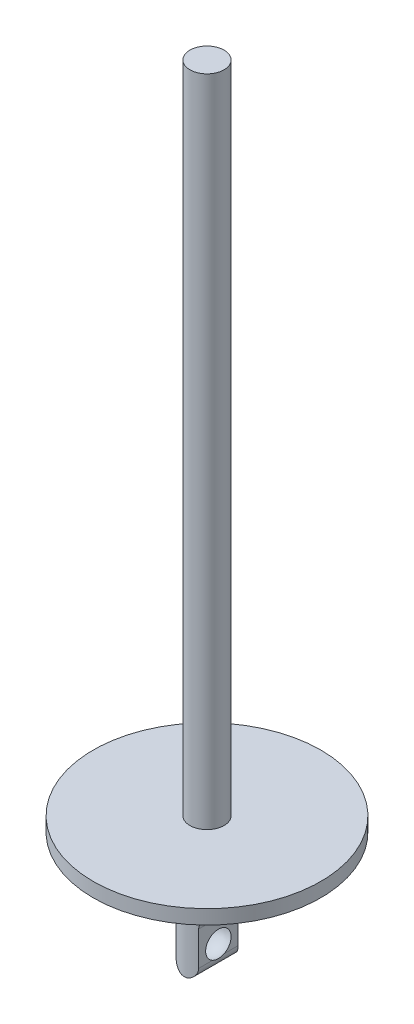
ISO-10303-21;
HEADER;
FILE_DESCRIPTION(('STEP AP214'),'2;1');
FILE_NAME('part.step','',(''),(''),'','','');
FILE_SCHEMA(('AUTOMOTIVE_DESIGN { 1 0 10303 214 1 1 1 1 }'));
ENDSEC;
DATA;
#1=APPLICATION_CONTEXT('core data for automotive mechanical design processes');
#2=APPLICATION_PROTOCOL_DEFINITION('international standard','automotive_design',2000,#1);
#3=PRODUCT_CONTEXT('',#1,'mechanical');
#4=PRODUCT('Part','Part','',(#3));
#5=PRODUCT_RELATED_PRODUCT_CATEGORY('part','',(#4));
#6=PRODUCT_DEFINITION_FORMATION('','',#4);
#7=PRODUCT_DEFINITION_CONTEXT('part definition',#1,'design');
#8=PRODUCT_DEFINITION('design','',#6,#7);
#9=PRODUCT_DEFINITION_SHAPE('','',#8);
#10=(LENGTH_UNIT() NAMED_UNIT(*) SI_UNIT(.MILLI.,.METRE.));
#11=(NAMED_UNIT(*) PLANE_ANGLE_UNIT() SI_UNIT($,.RADIAN.));
#12=(NAMED_UNIT(*) SI_UNIT($,.STERADIAN.) SOLID_ANGLE_UNIT());
#13=UNCERTAINTY_MEASURE_WITH_UNIT(LENGTH_MEASURE(1.E-05),#10,'distance_accuracy_value','');
#14=(GEOMETRIC_REPRESENTATION_CONTEXT(3) GLOBAL_UNCERTAINTY_ASSIGNED_CONTEXT((#13)) GLOBAL_UNIT_ASSIGNED_CONTEXT((#10,
#11,#12)) REPRESENTATION_CONTEXT('',''));
#15=CARTESIAN_POINT('',(0.,0.,0.));
#16=DIRECTION('',(0.,0.,1.));
#17=DIRECTION('',(1.,0.,0.));
#18=AXIS2_PLACEMENT_3D('',#15,#16,#17);
#19=CARTESIAN_POINT('',(4.,0.,-40.));
#20=DIRECTION('',(-1.,0.,0.));
#21=DIRECTION('',(0.,0.,1.));
#22=AXIS2_PLACEMENT_3D('',#19,#20,#21);
#23=PLANE('',#22);
#24=DIRECTION('',(0.,-1.,0.));
#25=VECTOR('',#24,1.);
#26=CARTESIAN_POINT('',(4.,40.,6.92820323027551));
#27=LINE('',#26,#25);
#28=CARTESIAN_POINT('',(4.,4.,6.92820323027551));
#29=VERTEX_POINT('',#28);
#30=CARTESIAN_POINT('',(4.,16.,6.92820323027551));
#31=VERTEX_POINT('',#30);
#32=EDGE_CURVE('E115',#29,#31,#27,.F.);
#33=ORIENTED_EDGE('',*,*,#32,.F.);
#34=DIRECTION('',(0.,0.,1.));
#35=VECTOR('',#34,1.);
#36=CARTESIAN_POINT('',(4.,4.,-40.));
#37=LINE('',#36,#35);
#38=CARTESIAN_POINT('',(4.,4.,2.));
#39=VERTEX_POINT('',#38);
#40=EDGE_CURVE('E223',#29,#39,#37,.F.);
#41=ORIENTED_EDGE('',*,*,#40,.T.);
#42=CARTESIAN_POINT('',(4.,8.,0.));
#43=DIRECTION('',(-1.,0.,0.));
#44=DIRECTION('',(0.,0.,1.));
#45=AXIS2_PLACEMENT_3D('',#42,#43,#44);
#46=CIRCLE('',#45,4.47213595499958);
#47=CARTESIAN_POINT('',(4.,4.,-2.));
#48=VERTEX_POINT('',#47);
#49=EDGE_CURVE('E119',#48,#39,#46,.F.);
#50=ORIENTED_EDGE('',*,*,#49,.F.);
#51=DIRECTION('',(0.,0.,1.));
#52=VECTOR('',#51,1.);
#53=CARTESIAN_POINT('',(4.,4.,-40.));
#54=LINE('',#53,#52);
#55=CARTESIAN_POINT('',(4.,4.,-6.92820323027551));
#56=VERTEX_POINT('',#55);
#57=EDGE_CURVE('E224',#48,#56,#54,.F.);
#58=ORIENTED_EDGE('',*,*,#57,.T.);
#59=DIRECTION('',(0.,-1.,0.));
#60=VECTOR('',#59,1.);
#61=CARTESIAN_POINT('',(4.,40.,-6.92820323027551));
#62=LINE('',#61,#60);
#63=CARTESIAN_POINT('',(4.,16.,-6.92820323027551));
#64=VERTEX_POINT('',#63);
#65=EDGE_CURVE('E117',#64,#56,#62,.T.);
#66=ORIENTED_EDGE('',*,*,#65,.F.);
#67=DIRECTION('',(0.,0.,1.));
#68=VECTOR('',#67,1.);
#69=CARTESIAN_POINT('',(4.,16.,6.92820323027551));
#70=LINE('',#69,#68);
#71=EDGE_CURVE('E230',#64,#31,#70,.T.);
#72=ORIENTED_EDGE('',*,*,#71,.T.);
#73=EDGE_LOOP('',(#33,#41,#50,#58,#66,#72));
#74=FACE_BOUND('',#73,.T.);
#75=ADVANCED_FACE('F35',(#74),#23,.F.);
#76=CARTESIAN_POINT('',(-4.,0.,-40.));
#77=DIRECTION('',(-1.,0.,0.));
#78=DIRECTION('',(0.,0.,1.));
#79=AXIS2_PLACEMENT_3D('',#76,#77,#78);
#80=PLANE('',#79);
#81=DIRECTION('',(0.,-1.,0.));
#82=VECTOR('',#81,1.);
#83=CARTESIAN_POINT('',(-4.,40.,-6.92820323027551));
#84=LINE('',#83,#82);
#85=CARTESIAN_POINT('',(-4.,16.,-6.92820323027551));
#86=VERTEX_POINT('',#85);
#87=CARTESIAN_POINT('',(-4.,4.,-6.92820323027551));
#88=VERTEX_POINT('',#87);
#89=EDGE_CURVE('E105',#86,#88,#84,.T.);
#90=ORIENTED_EDGE('',*,*,#89,.T.);
#91=DIRECTION('',(0.,0.,1.));
#92=VECTOR('',#91,1.);
#93=CARTESIAN_POINT('',(-4.,4.,6.92820323027551));
#94=LINE('',#93,#92);
#95=CARTESIAN_POINT('',(-4.,4.,-2.));
#96=VERTEX_POINT('',#95);
#97=EDGE_CURVE('E143',#88,#96,#94,.T.);
#98=ORIENTED_EDGE('',*,*,#97,.T.);
#99=CARTESIAN_POINT('',(-4.,8.,0.));
#100=DIRECTION('',(-1.,0.,0.));
#101=DIRECTION('',(0.,0.,1.));
#102=AXIS2_PLACEMENT_3D('',#99,#100,#101);
#103=CIRCLE('',#102,4.47213595499958);
#104=CARTESIAN_POINT('',(-4.,4.,2.));
#105=VERTEX_POINT('',#104);
#106=EDGE_CURVE('E139',#96,#105,#103,.F.);
#107=ORIENTED_EDGE('',*,*,#106,.T.);
#108=DIRECTION('',(0.,0.,1.));
#109=VECTOR('',#108,1.);
#110=CARTESIAN_POINT('',(-4.,4.,6.92820323027551));
#111=LINE('',#110,#109);
#112=CARTESIAN_POINT('',(-4.,4.,6.92820323027551));
#113=VERTEX_POINT('',#112);
#114=EDGE_CURVE('E109',#105,#113,#111,.T.);
#115=ORIENTED_EDGE('',*,*,#114,.T.);
#116=DIRECTION('',(0.,-1.,0.));
#117=VECTOR('',#116,1.);
#118=CARTESIAN_POINT('',(-4.,40.,6.92820323027551));
#119=LINE('',#118,#117);
#120=CARTESIAN_POINT('',(-4.,16.,6.92820323027551));
#121=VERTEX_POINT('',#120);
#122=EDGE_CURVE('E108',#113,#121,#119,.F.);
#123=ORIENTED_EDGE('',*,*,#122,.T.);
#124=DIRECTION('',(0.,0.,1.));
#125=VECTOR('',#124,1.);
#126=CARTESIAN_POINT('',(-4.,16.,-6.92820323027551));
#127=LINE('',#126,#125);
#128=EDGE_CURVE('E99',#121,#86,#127,.F.);
#129=ORIENTED_EDGE('',*,*,#128,.T.);
#130=EDGE_LOOP('',(#90,#98,#107,#115,#123,#129));
#131=FACE_BOUND('',#130,.T.);
#132=ADVANCED_FACE('F103',(#131),#80,.T.);
#133=CARTESIAN_POINT('',(0.,40.,0.));
#134=DIRECTION('',(0.,-1.,0.));
#135=DIRECTION('',(0.,0.,-1.));
#136=AXIS2_PLACEMENT_3D('',#133,#134,#135);
#137=CYLINDRICAL_SURFACE('',#136,8.);
#138=CARTESIAN_POINT('',(0.,40.,0.));
#139=DIRECTION('',(0.,1.,0.));
#140=DIRECTION('',(0.,0.,1.));
#141=AXIS2_PLACEMENT_3D('',#138,#139,#140);
#142=CIRCLE('',#141,8.);
#143=CARTESIAN_POINT('',(0.,40.,8.));
#144=VERTEX_POINT('',#143);
#145=EDGE_CURVE('E110',#144,#144,#142,.T.);
#146=ORIENTED_EDGE('',*,*,#145,.F.);
#147=EDGE_LOOP('',(#146));
#148=FACE_BOUND('',#147,.T.);
#149=ORIENTED_EDGE('',*,*,#122,.F.);
#150=CARTESIAN_POINT('',(-4.,4.,6.92820323027551));
#151=CARTESIAN_POINT('',(-4.00001889511112,3.89523971130093,6.92817241064342));
#152=CARTESIAN_POINT('',(-3.9958851388229,3.79049652922698,6.93057853736818));
#153=CARTESIAN_POINT('',(-3.97946096093408,3.58192507530325,6.94003264237105));
#154=CARTESIAN_POINT('',(-3.96717555222761,3.47809628088356,6.94707776785642));
#155=CARTESIAN_POINT('',(-3.93469109728926,3.27270248431589,6.96552456610761));
#156=CARTESIAN_POINT('',(-3.91453848374761,3.17112782917601,6.97690066761948));
#157=CARTESIAN_POINT('',(-3.86658519524572,2.97034740767348,7.00358982135438));
#158=CARTESIAN_POINT('',(-3.83878364235436,2.87114191466028,7.018903325492));
#159=CARTESIAN_POINT('',(-3.74447669890891,2.57846187257637,7.06993863228255));
#160=CARTESIAN_POINT('',(-3.66696933640402,2.38930687754068,7.11081556166273));
#161=CARTESIAN_POINT('',(-3.48522192136891,2.02653902083935,7.2016321692887));
#162=CARTESIAN_POINT('',(-3.38093933259429,1.85295148787515,7.25158623059337));
#163=CARTESIAN_POINT('',(-3.13866436996509,1.51077440200365,7.35987761255747));
#164=CARTESIAN_POINT('',(-2.99861322198538,1.34375338254482,7.41856641759924));
#165=CARTESIAN_POINT('',(-2.69295217819015,1.03431783180104,7.53489750387284));
#166=CARTESIAN_POINT('',(-2.5273344243365,0.891910894411421,7.59253945724062));
#167=CARTESIAN_POINT('',(-2.25622055414173,0.694986071525579,7.67588941919854));
#168=CARTESIAN_POINT('',(-2.15861234463414,0.630407746082989,7.70397528414256));
#169=CARTESIAN_POINT('',(-1.95758499573506,0.50978763068386,7.75749034734717));
#170=CARTESIAN_POINT('',(-1.85416837571886,0.453742178177164,7.78292068395482));
#171=CARTESIAN_POINT('',(-1.64226130195918,0.350774550177898,7.83037427609883));
#172=CARTESIAN_POINT('',(-1.53377549204667,0.30384422008848,7.85240057332805));
#173=CARTESIAN_POINT('',(-1.31247036586189,0.219600120257664,7.89240442815357));
#174=CARTESIAN_POINT('',(-1.19965387926253,0.182280189943056,7.91038457852208));
#175=CARTESIAN_POINT('',(-0.997570785436065,0.125321816701381,7.93805196091601));
#176=CARTESIAN_POINT('',(-0.90901862461868,0.103589144047799,7.9486949698625));
#177=CARTESIAN_POINT('',(-0.730360697796369,0.066185096871143,7.96709704429469));
#178=CARTESIAN_POINT('',(-0.640255280744232,0.0505123789954081,7.97485674892778));
#179=CARTESIAN_POINT('',(-0.458751817582987,0.0253357155205294,7.98735435689842));
#180=CARTESIAN_POINT('',(-0.367351140845406,0.0158470108604004,7.99208479389587));
#181=CARTESIAN_POINT('',(-0.183968921271151,0.00317271045894419,7.99841382965378));
#182=CARTESIAN_POINT('',(-0.091987154991078,-1.02912682492411E-05,8.00001113951861));
#183=CARTESIAN_POINT('',(0.,0.,8.));
#184=B_SPLINE_CURVE_WITH_KNOTS('',3,(#150,#151,#152,#153,#154,#155,#156,#157,#158,#159,#160,
#161,#162,#163,#164,#165,#166,#167,#168,#169,#170,#171,#172,#173,#174,#175,#176,#177,#178,#179,
#180,#181,#182,#183),.UNSPECIFIED.,.F.,.F.,(4,2,2,2,2,2,2,2,2,2,2,2,2,2,2,2,4),(0.,
0.314143681874408,0.628094358546584,0.940219432825869,1.25238034720108,1.87484254292889,
2.49829979351164,3.17272191455751,3.84735173721949,4.2080362349451,4.56856547755992,
4.92877068163394,5.28874440462505,5.56390038451801,5.83899533363794,6.11476573525637,
6.39064955863021),.UNSPECIFIED.);
#185=CARTESIAN_POINT('',(0.,0.,8.));
#186=VERTEX_POINT('',#185);
#187=EDGE_CURVE('E199',#113,#186,#184,.T.);
#188=ORIENTED_EDGE('',*,*,#187,.T.);
#189=CARTESIAN_POINT('',(0.,0.,8.));
#190=CARTESIAN_POINT('',(0.105594682815034,-1.69654241774166E-05,8.00001874517194));
#191=CARTESIAN_POINT('',(0.211177348556156,0.00418086172791801,7.99790982858387));
#192=CARTESIAN_POINT('',(0.421479944942973,0.0208743247073179,7.98957730399685));
#193=CARTESIAN_POINT('',(0.526200205052481,0.0333666272651057,7.98335534889358));
#194=CARTESIAN_POINT('',(0.733549997385983,0.0664416277232895,7.96697472634551));
#195=CARTESIAN_POINT('',(0.836186902712697,0.0869870514398855,7.956834199177));
#196=CARTESIAN_POINT('',(1.03911455405645,0.135915517762744,7.93288714668069));
#197=CARTESIAN_POINT('',(1.13940515446159,0.164299045410226,7.91908039447986));
#198=CARTESIAN_POINT('',(1.43550979836389,0.260712761075189,7.87267696868857));
#199=CARTESIAN_POINT('',(1.62698671481587,0.340075956974583,7.83506109947247));
#200=CARTESIAN_POINT('',(1.99372967134751,0.526172356981913,7.74988077275273));
#201=CARTESIAN_POINT('',(2.16897909699032,0.632933199454451,7.70230627811135));
#202=CARTESIAN_POINT('',(2.51001916646317,0.87806687837632,7.59825185414079));
#203=CARTESIAN_POINT('',(2.67461462257841,1.01795009685097,7.54140920704196));
#204=CARTESIAN_POINT('',(2.97910921395157,1.32206695818518,7.42640315399995));
#205=CARTESIAN_POINT('',(3.11898832089479,1.486320152225,7.36823871965682));
#206=CARTESIAN_POINT('',(3.38112219764268,1.85011586597194,7.25190771644084));
#207=CARTESIAN_POINT('',(3.50113933782059,2.05141453628313,7.1940975941462));
#208=CARTESIAN_POINT('',(3.65396057094637,2.36832787229876,7.11700985885203));
#209=CARTESIAN_POINT('',(3.70035498768008,2.47641790945865,7.09292552193289));
#210=CARTESIAN_POINT('',(3.78364788460679,2.6969761670208,7.04884597286059));
#211=CARTESIAN_POINT('',(3.82055280546655,2.80944135793523,7.02884798913949));
#212=CARTESIAN_POINT('',(3.87669185924337,3.01036704836625,6.99800135068758));
#213=CARTESIAN_POINT('',(3.89804119248436,3.09808465306088,6.98610914498016));
#214=CARTESIAN_POINT('',(3.93480596648565,3.27510700361364,6.96546802001393));
#215=CARTESIAN_POINT('',(3.95022287093019,3.3644113522848,6.95671832545156));
#216=CARTESIAN_POINT('',(3.97501646212313,3.54445090359165,6.94258315359293));
#217=CARTESIAN_POINT('',(3.98437113472389,3.63519010881508,6.93720993963143));
#218=CARTESIAN_POINT('',(3.99687028574113,3.81728325516172,6.93000987487536));
#219=CARTESIAN_POINT('',(4.00001140687759,3.90863750186975,6.92818494128182));
#220=CARTESIAN_POINT('',(4.,4.,6.92820323027551));
#221=B_SPLINE_CURVE_WITH_KNOTS('',3,(#189,#190,#191,#192,#193,#194,#195,#196,#197,#198,#199,
#200,#201,#202,#203,#204,#205,#206,#207,#208,#209,#210,#211,#212,#213,#214,#215,#216,#217,#218,
#219,#220),.UNSPECIFIED.,.F.,.F.,(4,2,2,2,2,2,2,2,2,2,2,2,2,2,2,4),(0.,0.316659613551836,
0.633192049259075,0.948276381733998,1.26338021677619,1.89229300054356,2.5218427339614,
3.18909856836255,3.85689264275289,4.57697601709805,4.93675650919362,5.29629216432158,
5.56922814326256,5.84209673856643,6.11595074645078,6.38995268160922),.UNSPECIFIED.);
#222=EDGE_CURVE('E193',#186,#29,#221,.T.);
#223=ORIENTED_EDGE('',*,*,#222,.T.);
#224=ORIENTED_EDGE('',*,*,#32,.T.);
#225=CARTESIAN_POINT('',(4.,16.,6.92820323027551));
#226=CARTESIAN_POINT('',(3.99998357269862,16.0979942978552,6.92819687421308));
#227=CARTESIAN_POINT('',(4.00360039286629,16.1959870130739,6.92612404616006));
#228=CARTESIAN_POINT('',(4.01798256563666,16.3912620961276,6.91779905606764));
#229=CARTESIAN_POINT('',(4.02874748699655,16.4885445064572,6.91154714615087));
#230=CARTESIAN_POINT('',(4.05728851629562,16.6815725180978,6.89482898223557));
#231=CARTESIAN_POINT('',(4.07505507470297,16.7773200285249,6.88436846794728));
#232=CARTESIAN_POINT('',(4.1173652650708,16.9667269459903,6.85914814827643));
#233=CARTESIAN_POINT('',(4.14190879704184,17.0603863838147,6.84438840632573));
#234=CARTESIAN_POINT('',(4.19746115576878,17.2449871828087,6.8104608710796));
#235=CARTESIAN_POINT('',(4.22847235072967,17.3359275343707,6.79129146287148));
#236=CARTESIAN_POINT('',(4.29654722462371,17.5144527301295,6.74842940726129));
#237=CARTESIAN_POINT('',(4.33361311971043,17.6020363311348,6.72473510310871));
#238=CARTESIAN_POINT('',(4.41324686894522,17.7731614380423,6.67274377700483));
#239=CARTESIAN_POINT('',(4.45581067734037,17.8567058547426,6.64445013565202));
#240=CARTESIAN_POINT('',(4.54587661740419,18.0193255282276,6.58315833487947));
#241=CARTESIAN_POINT('',(4.59338056260804,18.0983991272044,6.55015844612319));
#242=CARTESIAN_POINT('',(4.69290734869698,18.2520112196884,6.47922591643649));
#243=CARTESIAN_POINT('',(4.7449529546435,18.3265232559707,6.44126788845226));
#244=CARTESIAN_POINT('',(4.85259969134724,18.4702118722569,6.36056726199054));
#245=CARTESIAN_POINT('',(4.90820208934683,18.5393865310326,6.31782295410232));
#246=CARTESIAN_POINT('',(5.07916508086168,18.7384733242557,6.18248409002506));
#247=CARTESIAN_POINT('',(5.19874940709528,18.8600507877029,6.08273654037452));
#248=CARTESIAN_POINT('',(5.4501926229447,19.0869057388067,5.85879327573809));
#249=CARTESIAN_POINT('',(5.58235344124037,19.1907125797709,5.73346802078703));
#250=CARTESIAN_POINT('',(5.84542628459508,19.373950533241,5.46500734543136));
#251=CARTESIAN_POINT('',(5.97633780145532,19.4533721041083,5.32186498413528));
#252=CARTESIAN_POINT('',(6.19988925233047,19.5737215989879,5.05801173016824));
#253=CARTESIAN_POINT('',(6.29395690633154,19.6193107813145,4.94056359414615));
#254=CARTESIAN_POINT('',(6.47688877607476,19.7000172207874,4.69818635304316));
#255=CARTESIAN_POINT('',(6.56575082721865,19.7351301461812,4.57325417900766));
#256=CARTESIAN_POINT('',(6.73721638942498,19.7965372812035,4.31668752077667));
#257=CARTESIAN_POINT('',(6.81980479627336,19.8228106995745,4.18503806231928));
#258=CARTESIAN_POINT('',(6.97766120542416,19.8680178636714,3.91619221091376));
#259=CARTESIAN_POINT('',(7.0529272610161,19.8869496615369,3.77899435652669));
#260=CARTESIAN_POINT('',(7.21970032249709,19.9243760042334,3.45252788348875));
#261=CARTESIAN_POINT('',(7.3080596291559,19.9405452357865,3.26137858256724));
#262=CARTESIAN_POINT('',(7.46957400186451,19.9655170244585,2.87226179648576));
#263=CARTESIAN_POINT('',(7.54272294019432,19.9743166169159,2.67429160072329));
#264=CARTESIAN_POINT('',(7.67315222490469,19.9871624066746,2.27314642024895));
#265=CARTESIAN_POINT('',(7.73043943961995,19.9912106638339,2.06997373005238));
#266=CARTESIAN_POINT('',(7.82876270419721,19.9966361831549,1.65980222125565));
#267=CARTESIAN_POINT('',(7.86980547249243,19.998014550459,1.45280502156214));
#268=CARTESIAN_POINT('',(7.93504901307514,19.9996049849505,1.0384959270269));
#269=CARTESIAN_POINT('',(7.95943112101189,19.9998297887745,0.831212859058599));
#270=CARTESIAN_POINT('',(7.98378196715674,19.9999740719228,0.519661949906857));
#271=CARTESIAN_POINT('',(7.98986186395169,19.9999901135713,0.41583887891577));
#272=CARTESIAN_POINT('',(7.99797124060996,20.0000006341606,0.208014164773634));
#273=CARTESIAN_POINT('',(7.99999992175598,19.9999951088498,0.104012490454487));
#274=CARTESIAN_POINT('',(8.,20.,0.));
#275=B_SPLINE_CURVE_WITH_KNOTS('',3,(#225,#226,#227,#228,#229,#230,#231,#232,#233,#234,#235,
#236,#237,#238,#239,#240,#241,#242,#243,#244,#245,#246,#247,#248,#249,#250,#251,#252,#253,#254,
#255,#256,#257,#258,#259,#260,#261,#262,#263,#264,#265,#266,#267,#268,#269,#270,#271,#272,#273,
#274),.UNSPECIFIED.,.F.,.F.,(4,2,2,2,2,2,2,2,2,2,2,2,2,2,2,2,2,2,2,2,2,2,2,2,4),(0.,
0.293892036944188,0.587766345079801,0.881241217600609,1.17471176033982,1.46828994975949,
1.76197583703679,2.05544682774577,2.34902593517615,2.64417193263104,2.93942367916696,
3.52953673448329,4.15609945991866,4.78290703966625,5.25398364707331,5.72525476748456,
6.19762673157799,6.67012393861144,7.30284836022076,7.93582719238909,8.56853150622857,
9.20097386994807,9.82641810002737,10.1383526923261,10.4503487780106),.UNSPECIFIED.);
#276=CARTESIAN_POINT('',(8.,20.,0.));
#277=VERTEX_POINT('',#276);
#278=EDGE_CURVE('E57',#31,#277,#275,.T.);
#279=ORIENTED_EDGE('',*,*,#278,.T.);
#280=CARTESIAN_POINT('',(8.,20.,0.));
#281=CARTESIAN_POINT('',(8.00000131962729,19.9999913137288,-0.111840112448091));
#282=CARTESIAN_POINT('',(7.99765471096775,19.9999997736995,-0.223679206933449));
#283=CARTESIAN_POINT('',(7.98827577458516,19.9999878543693,-0.447160946197174));
#284=CARTESIAN_POINT('',(7.98124343899651,19.99996747502,-0.558803590645458));
#285=CARTESIAN_POINT('',(7.96249984169732,19.9998347212113,-0.781737419876212));
#286=CARTESIAN_POINT('',(7.95078691075725,19.9997223139172,-0.893028464981978));
#287=CARTESIAN_POINT('',(7.92270570658468,19.9992773661809,-1.11501339891618));
#288=CARTESIAN_POINT('',(7.90633744651494,19.9989448263611,-1.22570728943214));
#289=CARTESIAN_POINT('',(7.85006910609163,19.9973702031291,-1.55789304512798));
#290=CARTESIAN_POINT('',(7.80311110613446,19.9955484074128,-1.77823065891361));
#291=CARTESIAN_POINT('',(7.69081504724236,19.9884286267953,-2.21404342439892));
#292=CARTESIAN_POINT('',(7.62548207754534,19.9831316038726,-2.42951990464137));
#293=CARTESIAN_POINT('',(7.49098687984811,19.9679424238773,-2.81396742147681));
#294=CARTESIAN_POINT('',(7.42486810849519,19.9591047143132,-2.98404810882848));
#295=CARTESIAN_POINT('',(7.28131496344637,19.9355794312062,-3.31898127823584));
#296=CARTESIAN_POINT('',(7.20388043445886,19.920891777377,-3.48383368850355));
#297=CARTESIAN_POINT('',(7.03859723003294,19.8836655650522,-3.80669649006467));
#298=CARTESIAN_POINT('',(6.95078111650967,19.8611511456544,-3.96472625801525));
#299=CARTESIAN_POINT('',(6.7655180729736,19.805967649674,-4.27318224924326));
#300=CARTESIAN_POINT('',(6.66807470620119,19.7733023206154,-4.42361125478994));
#301=CARTESIAN_POINT('',(6.49387163575338,19.7064310596016,-4.67395425037869));
#302=CARTESIAN_POINT('',(6.41909913466045,19.6752984559767,-4.77607951703557));
#303=CARTESIAN_POINT('',(6.26611508355321,19.6056489566023,-4.97509170726807));
#304=CARTESIAN_POINT('',(6.18790443167382,19.5671339805915,-5.07197998431036));
#305=CARTESIAN_POINT('',(6.02904231951238,19.4818736180227,-5.25982586399754));
#306=CARTESIAN_POINT('',(5.94839299418043,19.435135267246,-5.35078844612732));
#307=CARTESIAN_POINT('',(5.78577043823031,19.3326293847017,-5.52622440413497));
#308=CARTESIAN_POINT('',(5.70379742805758,19.2768633427179,-5.61069884732466));
#309=CARTESIAN_POINT('',(5.55357884240452,19.1657919392138,-5.75907872914179));
#310=CARTESIAN_POINT('',(5.4853180876373,19.1119531139206,-5.82406821992398));
#311=CARTESIAN_POINT('',(5.34979778248046,18.9973817048656,-5.94879311808626));
#312=CARTESIAN_POINT('',(5.28253804764481,18.9366504093405,-6.00852950360528));
#313=CARTESIAN_POINT('',(5.15001107805503,18.8082160610026,-6.12250172792935));
#314=CARTESIAN_POINT('',(5.08474405814512,18.7405122598674,-6.17673697508364));
#315=CARTESIAN_POINT('',(4.95729159348913,18.5982760696794,-6.27948717084541));
#316=CARTESIAN_POINT('',(4.89510470977617,18.5237469165297,-6.32800480548109));
#317=CARTESIAN_POINT('',(4.77453363091258,18.3677274507891,-6.4194692394286));
#318=CARTESIAN_POINT('',(4.71616974698801,18.2862045570684,-6.46238732335727));
#319=CARTESIAN_POINT('',(4.60462855199429,18.1170061623685,-6.5423317844235));
#320=CARTESIAN_POINT('',(4.55144914586653,18.0293331714915,-6.57936054530073));
#321=CARTESIAN_POINT('',(4.45115206611111,17.8483478632115,-6.64762593779028));
#322=CARTESIAN_POINT('',(4.40403867264423,17.7550316314496,-6.67885848639655));
#323=CARTESIAN_POINT('',(4.31674448664777,17.5635527333737,-6.73560911729539));
#324=CARTESIAN_POINT('',(4.27656292647317,17.4653906052544,-6.76112783244263));
#325=CARTESIAN_POINT('',(4.2068599311223,17.2734315747937,-6.80469501491243));
#326=CARTESIAN_POINT('',(4.17672781127208,17.1799567872457,-6.82318991029318));
#327=CARTESIAN_POINT('',(4.12327615861386,16.9903107392453,-6.85562341920443));
#328=CARTESIAN_POINT('',(4.09995615143804,16.8941396670626,-6.86956235000182));
#329=CARTESIAN_POINT('',(4.06048396280482,16.7000061304892,-6.89296711021106));
#330=CARTESIAN_POINT('',(4.04431792082795,16.6020475164134,-6.90244159164346));
#331=CARTESIAN_POINT('',(4.01930937134345,16.4049223203777,-6.91703433517386));
#332=CARTESIAN_POINT('',(4.0104623645645,16.3057565186252,-6.92215527360319));
#333=CARTESIAN_POINT('',(4.00355081558526,16.1719917674771,-6.92615208600437));
#334=CARTESIAN_POINT('',(4.00221864091625,16.1375885633912,-6.92692187143991));
#335=CARTESIAN_POINT('',(4.00044384870011,16.0687915444225,-6.92794705900235));
#336=CARTESIAN_POINT('',(4.00000019988099,16.0343977650348,-6.92820305745944));
#337=CARTESIAN_POINT('',(4.,16.,-6.92820323027565));
#338=B_SPLINE_CURVE_WITH_KNOTS('',3,(#280,#281,#282,#283,#284,#285,#286,#287,#288,#289,#290,
#291,#292,#293,#294,#295,#296,#297,#298,#299,#300,#301,#302,#303,#304,#305,#306,#307,#308,#309,
#310,#311,#312,#313,#314,#315,#316,#317,#318,#319,#320,#321,#322,#323,#324,#325,#326,#327,#328,
#329,#330,#331,#332,#333,#334,#335,#336,#337),.UNSPECIFIED.,.F.,.F.,(4,2,2,2,2,2,2,2,2,2,2,2,2,
2,2,2,2,2,2,2,2,2,2,2,2,2,2,2,4),(0.,0.335493744561393,0.670988052293787,1.00660211348848,
1.3422152257567,2.0172176632674,2.69203333199167,3.23964117199473,3.78725652779131,
4.33319771156004,4.87893758312717,5.26965630997023,5.66027357042147,6.05055823621701,
6.44077856128155,6.76608585337826,7.0913324437638,7.41661397760881,7.7417420858653,
8.06847694236524,8.39507921250845,8.72191068386532,9.04870593798767,9.3481540968925,
9.64758139847144,9.94642600430207,10.2450867629247,10.3483882417461,10.4515697535404),.UNSPECIFIED.);
#339=EDGE_CURVE('E211',#277,#64,#338,.T.);
#340=ORIENTED_EDGE('',*,*,#339,.T.);
#341=ORIENTED_EDGE('',*,*,#65,.T.);
#342=CARTESIAN_POINT('',(4.,4.,-6.92820323027551));
#343=CARTESIAN_POINT('',(4.00001889511112,3.89523971130093,-6.92817241064342));
#344=CARTESIAN_POINT('',(3.9958851388229,3.79049652922698,-6.93057853736818));
#345=CARTESIAN_POINT('',(3.97946096093408,3.58192507530325,-6.94003264237105));
#346=CARTESIAN_POINT('',(3.96717555222761,3.47809628088356,-6.94707776785642));
#347=CARTESIAN_POINT('',(3.93469109728926,3.27270248431589,-6.96552456610761));
#348=CARTESIAN_POINT('',(3.91453848374761,3.17112782917601,-6.97690066761948));
#349=CARTESIAN_POINT('',(3.86658519524572,2.97034740767348,-7.00358982135438));
#350=CARTESIAN_POINT('',(3.83878364235436,2.87114191466028,-7.018903325492));
#351=CARTESIAN_POINT('',(3.74447669890891,2.57846187257637,-7.06993863228255));
#352=CARTESIAN_POINT('',(3.66696933640402,2.38930687754068,-7.11081556166273));
#353=CARTESIAN_POINT('',(3.48522192136891,2.02653902083935,-7.2016321692887));
#354=CARTESIAN_POINT('',(3.38093933259429,1.85295148787515,-7.25158623059337));
#355=CARTESIAN_POINT('',(3.13866436996509,1.51077440200365,-7.35987761255747));
#356=CARTESIAN_POINT('',(2.99861322198538,1.34375338254482,-7.41856641759924));
#357=CARTESIAN_POINT('',(2.69295217819015,1.03431783180104,-7.53489750387284));
#358=CARTESIAN_POINT('',(2.5273344243365,0.891910894411421,-7.59253945724062));
#359=CARTESIAN_POINT('',(2.25622055414173,0.694986071525579,-7.67588941919854));
#360=CARTESIAN_POINT('',(2.15861234463414,0.630407746082989,-7.70397528414256));
#361=CARTESIAN_POINT('',(1.95758499573506,0.50978763068386,-7.75749034734717));
#362=CARTESIAN_POINT('',(1.85416837571886,0.453742178177164,-7.78292068395482));
#363=CARTESIAN_POINT('',(1.64226130195918,0.350774550177898,-7.83037427609883));
#364=CARTESIAN_POINT('',(1.53377549204667,0.30384422008848,-7.85240057332805));
#365=CARTESIAN_POINT('',(1.31247036586189,0.219600120257664,-7.89240442815357));
#366=CARTESIAN_POINT('',(1.19965387926253,0.182280189943056,-7.91038457852208));
#367=CARTESIAN_POINT('',(0.997570785436065,0.125321816701381,-7.93805196091601));
#368=CARTESIAN_POINT('',(0.90901862461868,0.103589144047799,-7.9486949698625));
#369=CARTESIAN_POINT('',(0.730360697796369,0.066185096871143,-7.96709704429469));
#370=CARTESIAN_POINT('',(0.640255280744232,0.0505123789954081,-7.97485674892778));
#371=CARTESIAN_POINT('',(0.458751817582987,0.0253357155205294,-7.98735435689842));
#372=CARTESIAN_POINT('',(0.367351140845406,0.0158470108604004,-7.99208479389587));
#373=CARTESIAN_POINT('',(0.183968921271151,0.00317271045894419,-7.99841382965378));
#374=CARTESIAN_POINT('',(0.091987154991078,-1.02912682492411E-05,-8.00001113951861));
#375=CARTESIAN_POINT('',(0.,0.,-8.));
#376=B_SPLINE_CURVE_WITH_KNOTS('',3,(#342,#343,#344,#345,#346,#347,#348,#349,#350,#351,#352,
#353,#354,#355,#356,#357,#358,#359,#360,#361,#362,#363,#364,#365,#366,#367,#368,#369,#370,#371,
#372,#373,#374,#375),.UNSPECIFIED.,.F.,.F.,(4,2,2,2,2,2,2,2,2,2,2,2,2,2,2,2,4),(0.,
0.314143681874408,0.628094358546584,0.940219432825869,1.25238034720108,1.87484254292889,
2.49829979351164,3.17272191455751,3.84735173721949,4.2080362349451,4.56856547755992,
4.92877068163394,5.28874440462505,5.56390038451801,5.83899533363794,6.11476573525637,
6.39064955863021),.UNSPECIFIED.);
#377=CARTESIAN_POINT('',(0.,0.,-8.));
#378=VERTEX_POINT('',#377);
#379=EDGE_CURVE('E173',#56,#378,#376,.T.);
#380=ORIENTED_EDGE('',*,*,#379,.T.);
#381=CARTESIAN_POINT('',(0.,0.,-8.));
#382=CARTESIAN_POINT('',(-0.105594682815034,-1.69654241774166E-05,-8.00001874517194));
#383=CARTESIAN_POINT('',(-0.211177348556156,0.00418086172791801,-7.99790982858387));
#384=CARTESIAN_POINT('',(-0.421479944942973,0.0208743247073179,-7.98957730399685));
#385=CARTESIAN_POINT('',(-0.526200205052481,0.0333666272651057,-7.98335534889358));
#386=CARTESIAN_POINT('',(-0.733549997385983,0.0664416277232895,-7.96697472634551));
#387=CARTESIAN_POINT('',(-0.836186902712697,0.0869870514398855,-7.956834199177));
#388=CARTESIAN_POINT('',(-1.03911455405645,0.135915517762744,-7.93288714668069));
#389=CARTESIAN_POINT('',(-1.13940515446159,0.164299045410226,-7.91908039447986));
#390=CARTESIAN_POINT('',(-1.43550979836389,0.260712761075189,-7.87267696868857));
#391=CARTESIAN_POINT('',(-1.62698671481587,0.340075956974583,-7.83506109947247));
#392=CARTESIAN_POINT('',(-1.99372967134751,0.526172356981913,-7.74988077275273));
#393=CARTESIAN_POINT('',(-2.16897909699032,0.632933199454451,-7.70230627811135));
#394=CARTESIAN_POINT('',(-2.51001916646317,0.87806687837632,-7.59825185414079));
#395=CARTESIAN_POINT('',(-2.67461462257841,1.01795009685097,-7.54140920704196));
#396=CARTESIAN_POINT('',(-2.97910921395157,1.32206695818518,-7.42640315399995));
#397=CARTESIAN_POINT('',(-3.11898832089479,1.486320152225,-7.36823871965682));
#398=CARTESIAN_POINT('',(-3.38112219764268,1.85011586597194,-7.25190771644084));
#399=CARTESIAN_POINT('',(-3.50113933782059,2.05141453628313,-7.1940975941462));
#400=CARTESIAN_POINT('',(-3.65396057094637,2.36832787229876,-7.11700985885203));
#401=CARTESIAN_POINT('',(-3.70035498768008,2.47641790945865,-7.09292552193289));
#402=CARTESIAN_POINT('',(-3.78364788460679,2.6969761670208,-7.04884597286059));
#403=CARTESIAN_POINT('',(-3.82055280546655,2.80944135793523,-7.02884798913949));
#404=CARTESIAN_POINT('',(-3.87669185924337,3.01036704836625,-6.99800135068758));
#405=CARTESIAN_POINT('',(-3.89804119248436,3.09808465306088,-6.98610914498016));
#406=CARTESIAN_POINT('',(-3.93480596648565,3.27510700361364,-6.96546802001393));
#407=CARTESIAN_POINT('',(-3.95022287093019,3.3644113522848,-6.95671832545156));
#408=CARTESIAN_POINT('',(-3.97501646212313,3.54445090359165,-6.94258315359293));
#409=CARTESIAN_POINT('',(-3.98437113472389,3.63519010881508,-6.93720993963143));
#410=CARTESIAN_POINT('',(-3.99687028574113,3.81728325516172,-6.93000987487536));
#411=CARTESIAN_POINT('',(-4.00001140687759,3.90863750186975,-6.92818494128182));
#412=CARTESIAN_POINT('',(-4.,4.,-6.92820323027551));
#413=B_SPLINE_CURVE_WITH_KNOTS('',3,(#381,#382,#383,#384,#385,#386,#387,#388,#389,#390,#391,
#392,#393,#394,#395,#396,#397,#398,#399,#400,#401,#402,#403,#404,#405,#406,#407,#408,#409,#410,
#411,#412),.UNSPECIFIED.,.F.,.F.,(4,2,2,2,2,2,2,2,2,2,2,2,2,2,2,4),(0.,0.316659613551836,
0.633192049259075,0.948276381733998,1.26338021677619,1.89229300054356,2.5218427339614,
3.18909856836255,3.85689264275289,4.57697601709805,4.93675650919362,5.29629216432158,
5.56922814326256,5.84209673856643,6.11595074645078,6.38995268160922),.UNSPECIFIED.);
#414=EDGE_CURVE('E114',#378,#88,#413,.T.);
#415=ORIENTED_EDGE('',*,*,#414,.T.);
#416=ORIENTED_EDGE('',*,*,#89,.F.);
#417=CARTESIAN_POINT('',(-4.,16.,-6.92820323027551));
#418=CARTESIAN_POINT('',(-3.99998357269862,16.0979942978552,-6.92819687421308));
#419=CARTESIAN_POINT('',(-4.00360039286629,16.1959870130739,-6.92612404616006));
#420=CARTESIAN_POINT('',(-4.01798256563666,16.3912620961276,-6.91779905606764));
#421=CARTESIAN_POINT('',(-4.02874748699655,16.4885445064572,-6.91154714615087));
#422=CARTESIAN_POINT('',(-4.05728851629562,16.6815725180978,-6.89482898223557));
#423=CARTESIAN_POINT('',(-4.07505507470297,16.7773200285249,-6.88436846794728));
#424=CARTESIAN_POINT('',(-4.1173652650708,16.9667269459903,-6.85914814827643));
#425=CARTESIAN_POINT('',(-4.14190879704184,17.0603863838147,-6.84438840632573));
#426=CARTESIAN_POINT('',(-4.19746115576878,17.2449871828087,-6.8104608710796));
#427=CARTESIAN_POINT('',(-4.22847235072967,17.3359275343707,-6.79129146287148));
#428=CARTESIAN_POINT('',(-4.29654722462371,17.5144527301295,-6.74842940726129));
#429=CARTESIAN_POINT('',(-4.33361311971043,17.6020363311348,-6.72473510310871));
#430=CARTESIAN_POINT('',(-4.41324686894522,17.7731614380423,-6.67274377700483));
#431=CARTESIAN_POINT('',(-4.45581067734037,17.8567058547426,-6.64445013565202));
#432=CARTESIAN_POINT('',(-4.54587661740419,18.0193255282276,-6.58315833487947));
#433=CARTESIAN_POINT('',(-4.59338056260804,18.0983991272044,-6.55015844612319));
#434=CARTESIAN_POINT('',(-4.69290734869698,18.2520112196884,-6.47922591643649));
#435=CARTESIAN_POINT('',(-4.7449529546435,18.3265232559707,-6.44126788845226));
#436=CARTESIAN_POINT('',(-4.85259969134724,18.4702118722569,-6.36056726199054));
#437=CARTESIAN_POINT('',(-4.90820208934683,18.5393865310326,-6.31782295410232));
#438=CARTESIAN_POINT('',(-5.07916508086168,18.7384733242557,-6.18248409002506));
#439=CARTESIAN_POINT('',(-5.19874940709528,18.8600507877029,-6.08273654037452));
#440=CARTESIAN_POINT('',(-5.4501926229447,19.0869057388067,-5.85879327573809));
#441=CARTESIAN_POINT('',(-5.58235344124037,19.1907125797709,-5.73346802078703));
#442=CARTESIAN_POINT('',(-5.84542628459508,19.373950533241,-5.46500734543136));
#443=CARTESIAN_POINT('',(-5.97633780145532,19.4533721041083,-5.32186498413528));
#444=CARTESIAN_POINT('',(-6.19988925233047,19.5737215989879,-5.05801173016824));
#445=CARTESIAN_POINT('',(-6.29395690633154,19.6193107813145,-4.94056359414615));
#446=CARTESIAN_POINT('',(-6.47688877607476,19.7000172207874,-4.69818635304316));
#447=CARTESIAN_POINT('',(-6.56575082721865,19.7351301461812,-4.57325417900766));
#448=CARTESIAN_POINT('',(-6.73721638942498,19.7965372812035,-4.31668752077667));
#449=CARTESIAN_POINT('',(-6.81980479627336,19.8228106995745,-4.18503806231928));
#450=CARTESIAN_POINT('',(-6.97766120542416,19.8680178636714,-3.91619221091376));
#451=CARTESIAN_POINT('',(-7.0529272610161,19.8869496615369,-3.77899435652669));
#452=CARTESIAN_POINT('',(-7.21970032249709,19.9243760042334,-3.45252788348875));
#453=CARTESIAN_POINT('',(-7.3080596291559,19.9405452357865,-3.26137858256724));
#454=CARTESIAN_POINT('',(-7.46957400186451,19.9655170244585,-2.87226179648576));
#455=CARTESIAN_POINT('',(-7.54272294019432,19.9743166169159,-2.67429160072329));
#456=CARTESIAN_POINT('',(-7.67315222490469,19.9871624066746,-2.27314642024895));
#457=CARTESIAN_POINT('',(-7.73043943961995,19.9912106638339,-2.06997373005238));
#458=CARTESIAN_POINT('',(-7.82876270419721,19.9966361831549,-1.65980222125565));
#459=CARTESIAN_POINT('',(-7.86980547249243,19.998014550459,-1.45280502156214));
#460=CARTESIAN_POINT('',(-7.93504901307514,19.9996049849505,-1.0384959270269));
#461=CARTESIAN_POINT('',(-7.95943112101189,19.9998297887745,-0.831212859058599));
#462=CARTESIAN_POINT('',(-7.98378196715674,19.9999740719228,-0.519661949906857));
#463=CARTESIAN_POINT('',(-7.98986186395169,19.9999901135713,-0.41583887891577));
#464=CARTESIAN_POINT('',(-7.99797124060996,20.0000006341606,-0.208014164773634));
#465=CARTESIAN_POINT('',(-7.99999992175598,19.9999951088498,-0.104012490454487));
#466=CARTESIAN_POINT('',(-8.,20.,0.));
#467=B_SPLINE_CURVE_WITH_KNOTS('',3,(#417,#418,#419,#420,#421,#422,#423,#424,#425,#426,#427,
#428,#429,#430,#431,#432,#433,#434,#435,#436,#437,#438,#439,#440,#441,#442,#443,#444,#445,#446,
#447,#448,#449,#450,#451,#452,#453,#454,#455,#456,#457,#458,#459,#460,#461,#462,#463,#464,#465,
#466),.UNSPECIFIED.,.F.,.F.,(4,2,2,2,2,2,2,2,2,2,2,2,2,2,2,2,2,2,2,2,2,2,2,2,4),(0.,
0.293892036944188,0.587766345079801,0.881241217600609,1.17471176033982,1.46828994975949,
1.76197583703679,2.05544682774577,2.34902593517615,2.64417193263104,2.93942367916696,
3.52953673448329,4.15609945991866,4.78290703966625,5.25398364707331,5.72525476748456,
6.19762673157799,6.67012393861144,7.30284836022076,7.93582719238909,8.56853150622857,
9.20097386994807,9.82641810002737,10.1383526923261,10.4503487780106),.UNSPECIFIED.);
#468=CARTESIAN_POINT('',(-8.,20.,0.));
#469=VERTEX_POINT('',#468);
#470=EDGE_CURVE('E11',#86,#469,#467,.T.);
#471=ORIENTED_EDGE('',*,*,#470,.T.);
#472=CARTESIAN_POINT('',(-8.,20.,0.));
#473=CARTESIAN_POINT('',(-8.00000131962729,19.9999913137288,0.111840112448091));
#474=CARTESIAN_POINT('',(-7.99765471096775,19.9999997736995,0.223679206933449));
#475=CARTESIAN_POINT('',(-7.98827577458516,19.9999878543693,0.447160946197174));
#476=CARTESIAN_POINT('',(-7.98124343899651,19.99996747502,0.558803590645458));
#477=CARTESIAN_POINT('',(-7.96249984169732,19.9998347212113,0.781737419876212));
#478=CARTESIAN_POINT('',(-7.95078691075725,19.9997223139172,0.893028464981978));
#479=CARTESIAN_POINT('',(-7.92270570658468,19.9992773661809,1.11501339891618));
#480=CARTESIAN_POINT('',(-7.90633744651494,19.9989448263611,1.22570728943214));
#481=CARTESIAN_POINT('',(-7.85006910609163,19.9973702031291,1.55789304512798));
#482=CARTESIAN_POINT('',(-7.80311110613446,19.9955484074128,1.77823065891361));
#483=CARTESIAN_POINT('',(-7.69081504724236,19.9884286267953,2.21404342439892));
#484=CARTESIAN_POINT('',(-7.62548207754534,19.9831316038726,2.42951990464137));
#485=CARTESIAN_POINT('',(-7.49098687984811,19.9679424238773,2.81396742147681));
#486=CARTESIAN_POINT('',(-7.42486810849519,19.9591047143132,2.98404810882848));
#487=CARTESIAN_POINT('',(-7.28131496344637,19.9355794312062,3.31898127823584));
#488=CARTESIAN_POINT('',(-7.20388043445886,19.920891777377,3.48383368850355));
#489=CARTESIAN_POINT('',(-7.03859723003294,19.8836655650522,3.80669649006467));
#490=CARTESIAN_POINT('',(-6.95078111650967,19.8611511456544,3.96472625801525));
#491=CARTESIAN_POINT('',(-6.7655180729736,19.805967649674,4.27318224924326));
#492=CARTESIAN_POINT('',(-6.66807470620119,19.7733023206154,4.42361125478994));
#493=CARTESIAN_POINT('',(-6.49387163575338,19.7064310596016,4.67395425037869));
#494=CARTESIAN_POINT('',(-6.41909913466045,19.6752984559767,4.77607951703557));
#495=CARTESIAN_POINT('',(-6.26611508355321,19.6056489566023,4.97509170726807));
#496=CARTESIAN_POINT('',(-6.18790443167382,19.5671339805915,5.07197998431036));
#497=CARTESIAN_POINT('',(-6.02904231951238,19.4818736180227,5.25982586399754));
#498=CARTESIAN_POINT('',(-5.94839299418043,19.435135267246,5.35078844612732));
#499=CARTESIAN_POINT('',(-5.78577043823031,19.3326293847017,5.52622440413497));
#500=CARTESIAN_POINT('',(-5.70379742805758,19.2768633427179,5.61069884732466));
#501=CARTESIAN_POINT('',(-5.55357884240452,19.1657919392138,5.75907872914179));
#502=CARTESIAN_POINT('',(-5.4853180876373,19.1119531139206,5.82406821992398));
#503=CARTESIAN_POINT('',(-5.34979778248046,18.9973817048656,5.94879311808626));
#504=CARTESIAN_POINT('',(-5.28253804764481,18.9366504093405,6.00852950360528));
#505=CARTESIAN_POINT('',(-5.15001107805503,18.8082160610026,6.12250172792935));
#506=CARTESIAN_POINT('',(-5.08474405814512,18.7405122598674,6.17673697508364));
#507=CARTESIAN_POINT('',(-4.95729159348913,18.5982760696794,6.27948717084541));
#508=CARTESIAN_POINT('',(-4.89510470977617,18.5237469165297,6.32800480548109));
#509=CARTESIAN_POINT('',(-4.77453363091258,18.3677274507891,6.4194692394286));
#510=CARTESIAN_POINT('',(-4.71616974698801,18.2862045570684,6.46238732335727));
#511=CARTESIAN_POINT('',(-4.60462855199429,18.1170061623685,6.5423317844235));
#512=CARTESIAN_POINT('',(-4.55144914586653,18.0293331714915,6.57936054530073));
#513=CARTESIAN_POINT('',(-4.45115206611111,17.8483478632115,6.64762593779028));
#514=CARTESIAN_POINT('',(-4.40403867264423,17.7550316314496,6.67885848639655));
#515=CARTESIAN_POINT('',(-4.31674448664777,17.5635527333737,6.73560911729539));
#516=CARTESIAN_POINT('',(-4.27656292647317,17.4653906052544,6.76112783244263));
#517=CARTESIAN_POINT('',(-4.2068599311223,17.2734315747937,6.80469501491243));
#518=CARTESIAN_POINT('',(-4.17672781127208,17.1799567872457,6.82318991029318));
#519=CARTESIAN_POINT('',(-4.12327615861386,16.9903107392453,6.85562341920443));
#520=CARTESIAN_POINT('',(-4.09995615143804,16.8941396670626,6.86956235000182));
#521=CARTESIAN_POINT('',(-4.06048396280482,16.7000061304892,6.89296711021106));
#522=CARTESIAN_POINT('',(-4.04431792082795,16.6020475164134,6.90244159164346));
#523=CARTESIAN_POINT('',(-4.01930937134345,16.4049223203777,6.91703433517386));
#524=CARTESIAN_POINT('',(-4.0104623645645,16.3057565186252,6.92215527360319));
#525=CARTESIAN_POINT('',(-4.00355081558526,16.1719917674771,6.92615208600437));
#526=CARTESIAN_POINT('',(-4.00221864091625,16.1375885633912,6.92692187143991));
#527=CARTESIAN_POINT('',(-4.00044384870011,16.0687915444225,6.92794705900235));
#528=CARTESIAN_POINT('',(-4.00000019988099,16.0343977650348,6.92820305745944));
#529=CARTESIAN_POINT('',(-4.,16.,6.92820323027565));
#530=B_SPLINE_CURVE_WITH_KNOTS('',3,(#472,#473,#474,#475,#476,#477,#478,#479,#480,#481,#482,
#483,#484,#485,#486,#487,#488,#489,#490,#491,#492,#493,#494,#495,#496,#497,#498,#499,#500,#501,
#502,#503,#504,#505,#506,#507,#508,#509,#510,#511,#512,#513,#514,#515,#516,#517,#518,#519,#520,
#521,#522,#523,#524,#525,#526,#527,#528,#529),.UNSPECIFIED.,.F.,.F.,(4,2,2,2,2,2,2,2,2,2,2,2,2,
2,2,2,2,2,2,2,2,2,2,2,2,2,2,2,4),(0.,0.335493744561393,0.670988052293787,1.00660211348848,
1.3422152257567,2.0172176632674,2.69203333199167,3.23964117199473,3.78725652779131,
4.33319771156004,4.87893758312717,5.26965630997023,5.66027357042147,6.05055823621701,
6.44077856128155,6.76608585337826,7.0913324437638,7.41661397760881,7.7417420858653,
8.06847694236524,8.39507921250845,8.72191068386532,9.04870593798767,9.3481540968925,
9.64758139847144,9.94642600430207,10.2450867629247,10.3483882417461,10.4515697535404),.UNSPECIFIED.);
#531=EDGE_CURVE('E45',#469,#121,#530,.T.);
#532=ORIENTED_EDGE('',*,*,#531,.T.);
#533=EDGE_LOOP('',(#149,#188,#223,#224,#279,#340,#341,#380,#415,#416,#471,#532));
#534=FACE_BOUND('',#533,.T.);
#535=ADVANCED_FACE('F112',(#148,#534),#137,.T.);
#536=CARTESIAN_POINT('',(0.,45.,0.));
#537=DIRECTION('',(0.,1.,0.));
#538=DIRECTION('',(0.,0.,1.));
#539=AXIS2_PLACEMENT_3D('',#536,#537,#538);
#540=PLANE('',#539);
#541=CARTESIAN_POINT('',(0.,45.,0.));
#542=DIRECTION('',(0.,1.,0.));
#543=DIRECTION('',(0.,0.,1.));
#544=AXIS2_PLACEMENT_3D('',#541,#542,#543);
#545=CIRCLE('',#544,40.);
#546=CARTESIAN_POINT('',(0.,45.,40.));
#547=VERTEX_POINT('',#546);
#548=EDGE_CURVE('E132',#547,#547,#545,.T.);
#549=ORIENTED_EDGE('',*,*,#548,.T.);
#550=EDGE_LOOP('',(#549));
#551=FACE_BOUND('',#550,.T.);
#552=CARTESIAN_POINT('',(0.,45.,0.));
#553=DIRECTION('',(0.,1.,0.));
#554=DIRECTION('',(0.,0.,1.));
#555=AXIS2_PLACEMENT_3D('',#552,#553,#554);
#556=CIRCLE('',#555,6.);
#557=CARTESIAN_POINT('',(0.,45.,6.));
#558=VERTEX_POINT('',#557);
#559=EDGE_CURVE('E125',#558,#558,#556,.T.);
#560=ORIENTED_EDGE('',*,*,#559,.F.);
#561=EDGE_LOOP('',(#560));
#562=FACE_BOUND('',#561,.T.);
#563=ADVANCED_FACE('F184',(#551,#562),#540,.T.);
#564=CARTESIAN_POINT('',(0.,40.,0.));
#565=DIRECTION('',(0.,1.,0.));
#566=DIRECTION('',(0.,0.,1.));
#567=AXIS2_PLACEMENT_3D('',#564,#565,#566);
#568=PLANE('',#567);
#569=CARTESIAN_POINT('',(0.,40.,0.));
#570=DIRECTION('',(0.,1.,0.));
#571=DIRECTION('',(0.,0.,1.));
#572=AXIS2_PLACEMENT_3D('',#569,#570,#571);
#573=CIRCLE('',#572,40.);
#574=CARTESIAN_POINT('',(0.,40.,40.));
#575=VERTEX_POINT('',#574);
#576=EDGE_CURVE('E129',#575,#575,#573,.T.);
#577=ORIENTED_EDGE('',*,*,#576,.F.);
#578=EDGE_LOOP('',(#577));
#579=FACE_BOUND('',#578,.T.);
#580=ORIENTED_EDGE('',*,*,#145,.T.);
#581=EDGE_LOOP('',(#580));
#582=FACE_BOUND('',#581,.T.);
#583=ADVANCED_FACE('F264',(#579,#582),#568,.F.);
#584=CARTESIAN_POINT('',(0.,45.,0.));
#585=DIRECTION('',(0.,-1.,0.));
#586=DIRECTION('',(0.,0.,-1.));
#587=AXIS2_PLACEMENT_3D('',#584,#585,#586);
#588=CYLINDRICAL_SURFACE('',#587,40.);
#589=ORIENTED_EDGE('',*,*,#548,.F.);
#590=EDGE_LOOP('',(#589));
#591=FACE_BOUND('',#590,.T.);
#592=ORIENTED_EDGE('',*,*,#576,.T.);
#593=EDGE_LOOP('',(#592));
#594=FACE_BOUND('',#593,.T.);
#595=ADVANCED_FACE('F186',(#591,#594),#588,.T.);
#596=CARTESIAN_POINT('',(0.,275.,0.));
#597=DIRECTION('',(0.,-1.,0.));
#598=DIRECTION('',(0.,0.,-1.));
#599=AXIS2_PLACEMENT_3D('',#596,#597,#598);
#600=CYLINDRICAL_SURFACE('',#599,6.);
#601=CARTESIAN_POINT('',(0.,275.,0.));
#602=DIRECTION('',(0.,1.,0.));
#603=DIRECTION('',(0.,0.,1.));
#604=AXIS2_PLACEMENT_3D('',#601,#602,#603);
#605=CIRCLE('',#604,6.);
#606=CARTESIAN_POINT('',(0.,275.,6.));
#607=VERTEX_POINT('',#606);
#608=EDGE_CURVE('E126',#607,#607,#605,.T.);
#609=ORIENTED_EDGE('',*,*,#608,.F.);
#610=EDGE_LOOP('',(#609));
#611=FACE_BOUND('',#610,.T.);
#612=ORIENTED_EDGE('',*,*,#559,.T.);
#613=EDGE_LOOP('',(#612));
#614=FACE_BOUND('',#613,.T.);
#615=ADVANCED_FACE('F251',(#611,#614),#600,.T.);
#616=CARTESIAN_POINT('',(0.,275.,0.));
#617=DIRECTION('',(0.,1.,0.));
#618=DIRECTION('',(0.,0.,1.));
#619=AXIS2_PLACEMENT_3D('',#616,#617,#618);
#620=PLANE('',#619);
#621=ORIENTED_EDGE('',*,*,#608,.T.);
#622=EDGE_LOOP('',(#621));
#623=FACE_BOUND('',#622,.T.);
#624=ADVANCED_FACE('F247',(#623),#620,.T.);
#625=CARTESIAN_POINT('',(0.,8.,0.));
#626=DIRECTION('',(0.,0.,1.));
#627=DIRECTION('',(0.,1.,0.));
#628=AXIS2_PLACEMENT_3D('',#625,#626,#627);
#629=SPHERICAL_SURFACE('',#628,6.);
#630=ORIENTED_EDGE('',*,*,#106,.F.);
#631=CARTESIAN_POINT('',(-4.,4.,-2.));
#632=CARTESIAN_POINT('',(-3.9999975767312,3.94361016965603,-1.88725467018972));
#633=CARTESIAN_POINT('',(-3.99880583758753,3.89103602656893,-1.77253930457274));
#634=CARTESIAN_POINT('',(-3.9950120632865,3.79451939543857,-1.53939165536676));
#635=CARTESIAN_POINT('',(-3.99240821304736,3.7505881159073,-1.42095477324099));
#636=CARTESIAN_POINT('',(-3.9867717887295,3.67262206265485,-1.18122949592035));
#637=CARTESIAN_POINT('',(-3.98374048611627,3.63855882238311,-1.05995041615907));
#638=CARTESIAN_POINT('',(-3.97811381616892,3.58113604816054,-0.814914365061631));
#639=CARTESIAN_POINT('',(-3.97551824970357,3.55777161637803,-0.691158554689792));
#640=CARTESIAN_POINT('',(-3.97141623823066,3.52231950341212,-0.440856945076177));
#641=CARTESIAN_POINT('',(-3.96991991841722,3.51033636774424,-0.314296005509243));
#642=CARTESIAN_POINT('',(-3.96843564600229,3.49844672931985,-0.060576719772445));
#643=CARTESIAN_POINT('',(-3.96844791113415,3.49854196982975,0.0665817099845353));
#644=CARTESIAN_POINT('',(-3.96997893739151,3.51081219495517,0.320286016668554));
#645=CARTESIAN_POINT('',(-3.97149748316181,3.52298545275853,0.44683197856209));
#646=CARTESIAN_POINT('',(-3.9756509804891,3.55895609758145,0.698185403417703));
#647=CARTESIAN_POINT('',(-3.978285757503,3.58275166732979,0.822993135033572));
#648=CARTESIAN_POINT('',(-3.98534969188158,3.65520084568721,1.12910433605449));
#649=CARTESIAN_POINT('',(-3.99003470979214,3.71029924848891,1.30890930773313));
#650=CARTESIAN_POINT('',(-3.9955305561681,3.80819664119487,1.5726859240941));
#651=CARTESIAN_POINT('',(-3.99710701175131,3.84335950032538,1.65960093835279));
#652=CARTESIAN_POINT('',(-3.99934222260871,3.91831373440145,1.83135477429013));
#653=CARTESIAN_POINT('',(-4.00000161548904,3.95810187265292,1.91619499814908));
#654=CARTESIAN_POINT('',(-4.00000000000003,4.00000000000002,2.));
#655=B_SPLINE_CURVE_WITH_KNOTS('',3,(#631,#632,#633,#634,#635,#636,#637,#638,#639,#640,#641,
#642,#643,#644,#645,#646,#647,#648,#649,#650,#651,#652,#653,#654),.UNSPECIFIED.,.F.,.F.,(4,2,2,
2,2,2,2,2,2,2,2,4),(0.,0.378188767514976,0.756864802751094,1.13443733004262,1.5118368343238,
1.89267042500315,2.27355898127979,2.65439308919701,3.03516766873335,3.59787300434694,
3.87907798840461,4.16008736118882),.UNSPECIFIED.);
#656=EDGE_CURVE('E152',#96,#105,#655,.T.);
#657=ORIENTED_EDGE('',*,*,#656,.T.);
#658=EDGE_LOOP('',(#630,#657));
#659=FACE_BOUND('',#658,.T.);
#660=ORIENTED_EDGE('',*,*,#49,.T.);
#661=CARTESIAN_POINT('',(4.,4.,2.));
#662=CARTESIAN_POINT('',(3.9999975767312,3.94361016965603,1.88725467018973));
#663=CARTESIAN_POINT('',(3.99880583758753,3.89103602656893,1.77253930457274));
#664=CARTESIAN_POINT('',(3.9950120632865,3.79451939543857,1.53939165536676));
#665=CARTESIAN_POINT('',(3.99240821304736,3.7505881159073,1.42095477324099));
#666=CARTESIAN_POINT('',(3.9867717887295,3.67262206265485,1.18122949592035));
#667=CARTESIAN_POINT('',(3.98374048611627,3.63855882238311,1.05995041615907));
#668=CARTESIAN_POINT('',(3.97811381616892,3.58113604816054,0.814914365061632));
#669=CARTESIAN_POINT('',(3.97551824970357,3.55777161637803,0.691158554689794));
#670=CARTESIAN_POINT('',(3.97141623823066,3.52231950341212,0.440856945076179));
#671=CARTESIAN_POINT('',(3.96991991841722,3.51033636774424,0.314296005509245));
#672=CARTESIAN_POINT('',(3.96843564600229,3.49844672931985,0.0605767197724468));
#673=CARTESIAN_POINT('',(3.96844791113415,3.49854196982975,-0.0665817099845335));
#674=CARTESIAN_POINT('',(3.96997893739151,3.51081219495517,-0.320286016668552));
#675=CARTESIAN_POINT('',(3.97149748316181,3.52298545275853,-0.446831978562088));
#676=CARTESIAN_POINT('',(3.9756509804891,3.55895609758145,-0.698185403417701));
#677=CARTESIAN_POINT('',(3.978285757503,3.58275166732979,-0.82299313503357));
#678=CARTESIAN_POINT('',(3.98534969188158,3.65520084568721,-1.12910433605449));
#679=CARTESIAN_POINT('',(3.99003470979214,3.71029924848891,-1.30890930773313));
#680=CARTESIAN_POINT('',(3.9955305561681,3.80819664119487,-1.5726859240941));
#681=CARTESIAN_POINT('',(3.99710701175131,3.84335950032538,-1.65960093835278));
#682=CARTESIAN_POINT('',(3.99934222260871,3.91831373440145,-1.83135477429013));
#683=CARTESIAN_POINT('',(4.00000161548904,3.95810187265292,-1.91619499814907));
#684=CARTESIAN_POINT('',(4.00000000000003,4.00000000000002,-1.99999999999999));
#685=B_SPLINE_CURVE_WITH_KNOTS('',3,(#661,#662,#663,#664,#665,#666,#667,#668,#669,#670,#671,
#672,#673,#674,#675,#676,#677,#678,#679,#680,#681,#682,#683,#684),.UNSPECIFIED.,.F.,.F.,(4,2,2,
2,2,2,2,2,2,2,2,4),(0.,0.378188767514976,0.756864802751094,1.13443733004262,1.5118368343238,
1.89267042500315,2.27355898127979,2.65439308919701,3.03516766873335,3.59787300434694,
3.87907798840461,4.16008736118882),.UNSPECIFIED.);
#686=EDGE_CURVE('E145',#39,#48,#685,.T.);
#687=ORIENTED_EDGE('',*,*,#686,.T.);
#688=EDGE_LOOP('',(#660,#687));
#689=FACE_BOUND('',#688,.T.);
#690=ADVANCED_FACE('F158',(#659,#689),#629,.F.);
#691=CARTESIAN_POINT('',(0.,4.,0.));
#692=DIRECTION('',(0.,0.,1.));
#693=DIRECTION('',(1.,0.,0.));
#694=AXIS2_PLACEMENT_3D('',#691,#692,#693);
#695=CYLINDRICAL_SURFACE('',#694,4.);
#696=DIRECTION('',(0.,0.,1.));
#697=VECTOR('',#696,1.);
#698=CARTESIAN_POINT('',(0.,0.,0.));
#699=LINE('',#698,#697);
#700=EDGE_CURVE('E40',#378,#186,#699,.T.);
#701=ORIENTED_EDGE('',*,*,#700,.F.);
#702=ORIENTED_EDGE('',*,*,#379,.F.);
#703=ORIENTED_EDGE('',*,*,#57,.F.);
#704=ORIENTED_EDGE('',*,*,#686,.F.);
#705=ORIENTED_EDGE('',*,*,#40,.F.);
#706=ORIENTED_EDGE('',*,*,#222,.F.);
#707=EDGE_LOOP('',(#701,#702,#703,#704,#705,#706));
#708=FACE_BOUND('',#707,.T.);
#709=ADVANCED_FACE('F161',(#708),#695,.T.);
#710=CARTESIAN_POINT('',(0.,4.,-40.));
#711=DIRECTION('',(0.,0.,-1.));
#712=DIRECTION('',(-1.,0.,0.));
#713=AXIS2_PLACEMENT_3D('',#710,#711,#712);
#714=CYLINDRICAL_SURFACE('',#713,4.);
#715=ORIENTED_EDGE('',*,*,#414,.F.);
#716=ORIENTED_EDGE('',*,*,#700,.T.);
#717=ORIENTED_EDGE('',*,*,#187,.F.);
#718=ORIENTED_EDGE('',*,*,#114,.F.);
#719=ORIENTED_EDGE('',*,*,#656,.F.);
#720=ORIENTED_EDGE('',*,*,#97,.F.);
#721=EDGE_LOOP('',(#715,#716,#717,#718,#719,#720));
#722=FACE_BOUND('',#721,.T.);
#723=ADVANCED_FACE('F164',(#722),#714,.T.);
#724=CARTESIAN_POINT('',(8.,16.,-40.));
#725=DIRECTION('',(0.,0.,-1.));
#726=DIRECTION('',(-1.,0.,0.));
#727=AXIS2_PLACEMENT_3D('',#724,#725,#726);
#728=CYLINDRICAL_SURFACE('',#727,4.);
#729=ORIENTED_EDGE('',*,*,#71,.F.);
#730=ORIENTED_EDGE('',*,*,#339,.F.);
#731=ORIENTED_EDGE('',*,*,#278,.F.);
#732=EDGE_LOOP('',(#729,#730,#731));
#733=FACE_BOUND('',#732,.T.);
#734=ADVANCED_FACE('F168',(#733),#728,.F.);
#735=CARTESIAN_POINT('',(-8.,16.,-40.));
#736=DIRECTION('',(0.,0.,-1.));
#737=DIRECTION('',(-1.,0.,0.));
#738=AXIS2_PLACEMENT_3D('',#735,#736,#737);
#739=CYLINDRICAL_SURFACE('',#738,4.);
#740=ORIENTED_EDGE('',*,*,#470,.F.);
#741=ORIENTED_EDGE('',*,*,#128,.F.);
#742=ORIENTED_EDGE('',*,*,#531,.F.);
#743=EDGE_LOOP('',(#740,#741,#742));
#744=FACE_BOUND('',#743,.T.);
#745=ADVANCED_FACE('F37',(#744),#739,.F.);
#746=CLOSED_SHELL('',(#75,#132,#535,#563,#583,#595,#615,#624,#690,#709,#723,#734,#745));
#747=MANIFOLD_SOLID_BREP('B2',#746);
#748=ADVANCED_BREP_SHAPE_REPRESENTATION('',(#18,#747),#14);
#749=SHAPE_DEFINITION_REPRESENTATION(#9,#748);
ENDSEC;
END-ISO-10303-21;
